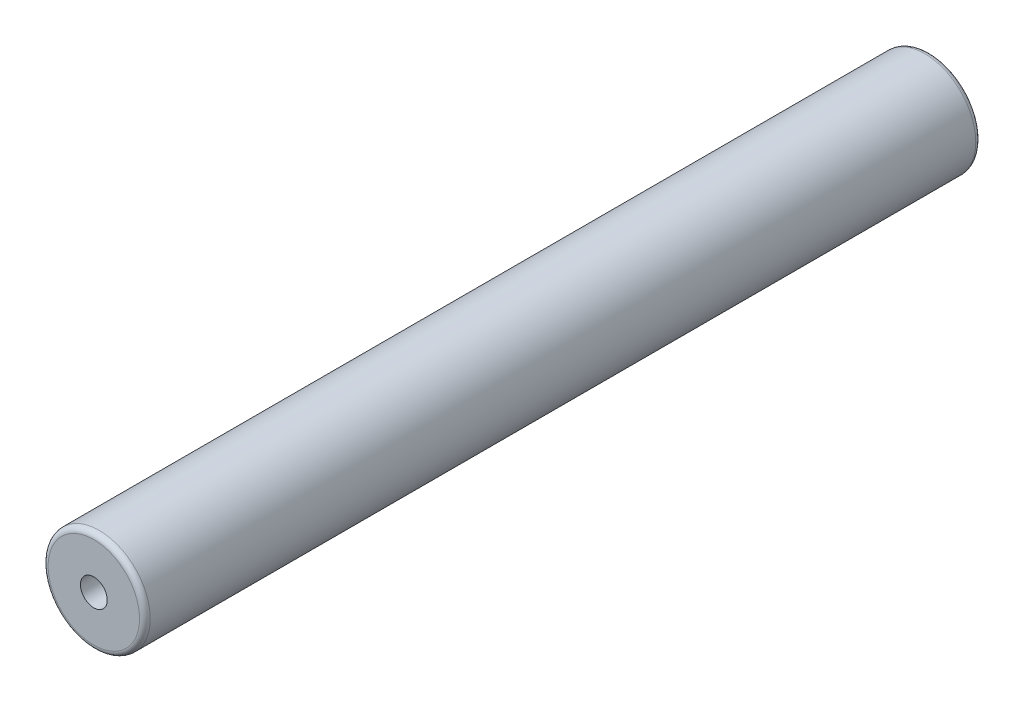
ISO-10303-21;
HEADER;
FILE_DESCRIPTION(('STEP AP214'),'2;1');
FILE_NAME('part.step','',(''),(''),'','','');
FILE_SCHEMA(('AUTOMOTIVE_DESIGN { 1 0 10303 214 1 1 1 1 }'));
ENDSEC;
DATA;
#1=APPLICATION_CONTEXT('core data for automotive mechanical design processes');
#2=APPLICATION_PROTOCOL_DEFINITION('international standard','automotive_design',2000,#1);
#3=PRODUCT_CONTEXT('',#1,'mechanical');
#4=PRODUCT('Part','Part','',(#3));
#5=PRODUCT_RELATED_PRODUCT_CATEGORY('part','',(#4));
#6=PRODUCT_DEFINITION_FORMATION('','',#4);
#7=PRODUCT_DEFINITION_CONTEXT('part definition',#1,'design');
#8=PRODUCT_DEFINITION('design','',#6,#7);
#9=PRODUCT_DEFINITION_SHAPE('','',#8);
#10=(LENGTH_UNIT() NAMED_UNIT(*) SI_UNIT(.MILLI.,.METRE.));
#11=(NAMED_UNIT(*) PLANE_ANGLE_UNIT() SI_UNIT($,.RADIAN.));
#12=(NAMED_UNIT(*) SI_UNIT($,.STERADIAN.) SOLID_ANGLE_UNIT());
#13=UNCERTAINTY_MEASURE_WITH_UNIT(LENGTH_MEASURE(1.E-05),#10,'distance_accuracy_value','');
#14=(GEOMETRIC_REPRESENTATION_CONTEXT(3) GLOBAL_UNCERTAINTY_ASSIGNED_CONTEXT((#13)) GLOBAL_UNIT_ASSIGNED_CONTEXT((#10,
#11,#12)) REPRESENTATION_CONTEXT('',''));
#15=CARTESIAN_POINT('',(0.,0.,0.));
#16=DIRECTION('',(0.,0.,1.));
#17=DIRECTION('',(1.,0.,0.));
#18=AXIS2_PLACEMENT_3D('',#15,#16,#17);
#19=CARTESIAN_POINT('',(240.708388301789,2.59608285867283,78.));
#20=DIRECTION('',(0.,0.,-1.));
#21=DIRECTION('',(-1.,0.,0.));
#22=AXIS2_PLACEMENT_3D('',#19,#20,#21);
#23=CYLINDRICAL_SURFACE('',#22,4.76250000000001);
#24=CARTESIAN_POINT('',(240.708388301789,2.59608285867283,77.5));
#25=DIRECTION('',(0.,0.,1.));
#26=DIRECTION('',(1.,0.,0.));
#27=AXIS2_PLACEMENT_3D('',#24,#25,#26);
#28=CIRCLE('',#27,4.76250000000001);
#29=CARTESIAN_POINT('',(245.470888301789,2.59608285867283,77.5));
#30=VERTEX_POINT('',#29);
#31=EDGE_CURVE('E11',#30,#30,#28,.F.);
#32=ORIENTED_EDGE('',*,*,#31,.T.);
#33=EDGE_LOOP('',(#32));
#34=FACE_BOUND('',#33,.T.);
#35=CARTESIAN_POINT('',(240.708388301789,2.59608285867283,0.5));
#36=DIRECTION('',(0.,0.,1.));
#37=DIRECTION('',(1.,0.,0.));
#38=AXIS2_PLACEMENT_3D('',#35,#36,#37);
#39=CIRCLE('',#38,4.76250000000001);
#40=CARTESIAN_POINT('',(245.470888301789,2.59608285867283,0.5));
#41=VERTEX_POINT('',#40);
#42=EDGE_CURVE('E68',#41,#41,#39,.T.);
#43=ORIENTED_EDGE('',*,*,#42,.T.);
#44=EDGE_LOOP('',(#43));
#45=FACE_BOUND('',#44,.T.);
#46=ADVANCED_FACE('F33',(#34,#45),#23,.T.);
#47=CARTESIAN_POINT('',(240.708388301789,2.59608285867283,78.));
#48=DIRECTION('',(0.,0.,1.));
#49=DIRECTION('',(1.,0.,0.));
#50=AXIS2_PLACEMENT_3D('',#47,#48,#49);
#51=PLANE('',#50);
#52=CARTESIAN_POINT('',(240.708388301789,2.59608285867283,78.));
#53=DIRECTION('',(0.,0.,1.));
#54=DIRECTION('',(1.,0.,0.));
#55=AXIS2_PLACEMENT_3D('',#52,#53,#54);
#56=CIRCLE('',#55,4.26250000000001);
#57=CARTESIAN_POINT('',(244.970888301789,2.59608285867283,78.));
#58=VERTEX_POINT('',#57);
#59=EDGE_CURVE('E41',#58,#58,#56,.T.);
#60=ORIENTED_EDGE('',*,*,#59,.T.);
#61=EDGE_LOOP('',(#60));
#62=FACE_BOUND('',#61,.T.);
#63=CARTESIAN_POINT('',(240.708388301789,2.59608285867283,78.));
#64=DIRECTION('',(0.,0.,1.));
#65=DIRECTION('',(1.,0.,0.));
#66=AXIS2_PLACEMENT_3D('',#63,#64,#65);
#67=CIRCLE('',#66,1.25);
#68=CARTESIAN_POINT('',(241.958388301789,2.59608285867283,78.));
#69=VERTEX_POINT('',#68);
#70=EDGE_CURVE('E58',#69,#69,#67,.T.);
#71=ORIENTED_EDGE('',*,*,#70,.F.);
#72=EDGE_LOOP('',(#71));
#73=FACE_BOUND('',#72,.T.);
#74=ADVANCED_FACE('F76',(#62,#73),#51,.T.);
#75=CARTESIAN_POINT('',(240.708388301789,2.59608285867283,0.));
#76=DIRECTION('',(0.,0.,1.));
#77=DIRECTION('',(1.,0.,0.));
#78=AXIS2_PLACEMENT_3D('',#75,#76,#77);
#79=PLANE('',#78);
#80=CARTESIAN_POINT('',(240.708388301789,2.59608285867283,0.));
#81=DIRECTION('',(0.,0.,1.));
#82=DIRECTION('',(1.,0.,0.));
#83=AXIS2_PLACEMENT_3D('',#80,#81,#82);
#84=CIRCLE('',#83,4.26250000000001);
#85=CARTESIAN_POINT('',(244.970888301789,2.59608285867283,0.));
#86=VERTEX_POINT('',#85);
#87=EDGE_CURVE('E71',#86,#86,#84,.F.);
#88=ORIENTED_EDGE('',*,*,#87,.T.);
#89=EDGE_LOOP('',(#88));
#90=FACE_BOUND('',#89,.T.);
#91=CARTESIAN_POINT('',(240.708388301787,2.59608285867252,0.));
#92=DIRECTION('',(0.,0.,-1.));
#93=DIRECTION('',(-1.,0.,0.));
#94=AXIS2_PLACEMENT_3D('',#91,#92,#93);
#95=CIRCLE('',#94,1.25);
#96=CARTESIAN_POINT('',(239.458388301787,2.59608285867252,0.));
#97=VERTEX_POINT('',#96);
#98=EDGE_CURVE('E57',#97,#97,#95,.T.);
#99=ORIENTED_EDGE('',*,*,#98,.F.);
#100=EDGE_LOOP('',(#99));
#101=FACE_BOUND('',#100,.T.);
#102=ADVANCED_FACE('F92',(#90,#101),#79,.F.);
#103=CARTESIAN_POINT('',(240.708388301787,2.59608285867252,8.49999999999999));
#104=DIRECTION('',(0.,0.,-1.));
#105=DIRECTION('',(-1.,0.,0.));
#106=AXIS2_PLACEMENT_3D('',#103,#104,#105);
#107=CONICAL_SURFACE('',#106,1.25,1.02974425867666);
#108=CARTESIAN_POINT('',(240.708388301787,2.59608285867252,9.25107577378444));
#109=VERTEX_POINT('',#108);
#110=VERTEX_LOOP('',#109);
#111=FACE_BOUND('',#110,.T.);
#112=CARTESIAN_POINT('',(240.708388301787,2.59608285867252,8.49999999999999));
#113=DIRECTION('',(0.,0.,-1.));
#114=DIRECTION('',(-1.,0.,0.));
#115=AXIS2_PLACEMENT_3D('',#112,#113,#114);
#116=CIRCLE('',#115,1.25);
#117=CARTESIAN_POINT('',(239.458388301787,2.59608285867252,8.49999999999999));
#118=VERTEX_POINT('',#117);
#119=EDGE_CURVE('E61',#118,#118,#116,.T.);
#120=ORIENTED_EDGE('',*,*,#119,.T.);
#121=EDGE_LOOP('',(#120));
#122=FACE_BOUND('',#121,.T.);
#123=ADVANCED_FACE('F102',(#111,#122),#107,.F.);
#124=CARTESIAN_POINT('',(240.708388301787,2.59608285867252,0.));
#125=DIRECTION('',(0.,0.,-1.));
#126=DIRECTION('',(-1.,0.,0.));
#127=AXIS2_PLACEMENT_3D('',#124,#125,#126);
#128=CYLINDRICAL_SURFACE('',#127,1.25);
#129=ORIENTED_EDGE('',*,*,#119,.F.);
#130=EDGE_LOOP('',(#129));
#131=FACE_BOUND('',#130,.T.);
#132=ORIENTED_EDGE('',*,*,#98,.T.);
#133=EDGE_LOOP('',(#132));
#134=FACE_BOUND('',#133,.T.);
#135=ADVANCED_FACE('F97',(#131,#134),#128,.F.);
#136=CARTESIAN_POINT('',(240.708388301789,2.59608285867283,0.5));
#137=DIRECTION('',(0.,0.,1.));
#138=DIRECTION('',(1.,0.,0.));
#139=AXIS2_PLACEMENT_3D('',#136,#137,#138);
#140=TOROIDAL_SURFACE('',#139,4.26250000000001,0.5);
#141=ORIENTED_EDGE('',*,*,#87,.F.);
#142=EDGE_LOOP('',(#141));
#143=FACE_BOUND('',#142,.T.);
#144=ORIENTED_EDGE('',*,*,#42,.F.);
#145=EDGE_LOOP('',(#144));
#146=FACE_BOUND('',#145,.T.);
#147=ADVANCED_FACE('F51',(#143,#146),#140,.T.);
#148=CARTESIAN_POINT('',(240.708388301789,2.59608285867283,73.));
#149=DIRECTION('',(0.,0.,1.));
#150=DIRECTION('',(1.,0.,0.));
#151=AXIS2_PLACEMENT_3D('',#148,#149,#150);
#152=CONICAL_SURFACE('',#151,1.25,1.02974425867666);
#153=CARTESIAN_POINT('',(240.708388301789,2.59608285867283,72.2489242262155));
#154=VERTEX_POINT('',#153);
#155=VERTEX_LOOP('',#154);
#156=FACE_BOUND('',#155,.T.);
#157=CARTESIAN_POINT('',(240.708388301789,2.59608285867283,73.));
#158=DIRECTION('',(0.,0.,1.));
#159=DIRECTION('',(1.,0.,0.));
#160=AXIS2_PLACEMENT_3D('',#157,#158,#159);
#161=CIRCLE('',#160,1.25);
#162=CARTESIAN_POINT('',(241.958388301789,2.59608285867283,73.));
#163=VERTEX_POINT('',#162);
#164=EDGE_CURVE('E55',#163,#163,#161,.T.);
#165=ORIENTED_EDGE('',*,*,#164,.T.);
#166=EDGE_LOOP('',(#165));
#167=FACE_BOUND('',#166,.T.);
#168=ADVANCED_FACE('F47',(#156,#167),#152,.F.);
#169=CARTESIAN_POINT('',(240.708388301789,2.59608285867283,78.));
#170=DIRECTION('',(0.,0.,1.));
#171=DIRECTION('',(1.,0.,0.));
#172=AXIS2_PLACEMENT_3D('',#169,#170,#171);
#173=CYLINDRICAL_SURFACE('',#172,1.25);
#174=ORIENTED_EDGE('',*,*,#164,.F.);
#175=EDGE_LOOP('',(#174));
#176=FACE_BOUND('',#175,.T.);
#177=ORIENTED_EDGE('',*,*,#70,.T.);
#178=EDGE_LOOP('',(#177));
#179=FACE_BOUND('',#178,.T.);
#180=ADVANCED_FACE('F50',(#176,#179),#173,.F.);
#181=CARTESIAN_POINT('',(240.708388301789,2.59608285867283,77.5));
#182=DIRECTION('',(0.,0.,1.));
#183=DIRECTION('',(1.,0.,0.));
#184=AXIS2_PLACEMENT_3D('',#181,#182,#183);
#185=TOROIDAL_SURFACE('',#184,4.26250000000001,0.5);
#186=ORIENTED_EDGE('',*,*,#31,.F.);
#187=EDGE_LOOP('',(#186));
#188=FACE_BOUND('',#187,.T.);
#189=ORIENTED_EDGE('',*,*,#59,.F.);
#190=EDGE_LOOP('',(#189));
#191=FACE_BOUND('',#190,.T.);
#192=ADVANCED_FACE('F35',(#188,#191),#185,.T.);
#193=CLOSED_SHELL('',(#46,#74,#102,#123,#135,#147,#168,#180,#192));
#194=MANIFOLD_SOLID_BREP('B2',#193);
#195=ADVANCED_BREP_SHAPE_REPRESENTATION('',(#18,#194),#14);
#196=SHAPE_DEFINITION_REPRESENTATION(#9,#195);
ENDSEC;
END-ISO-10303-21;
